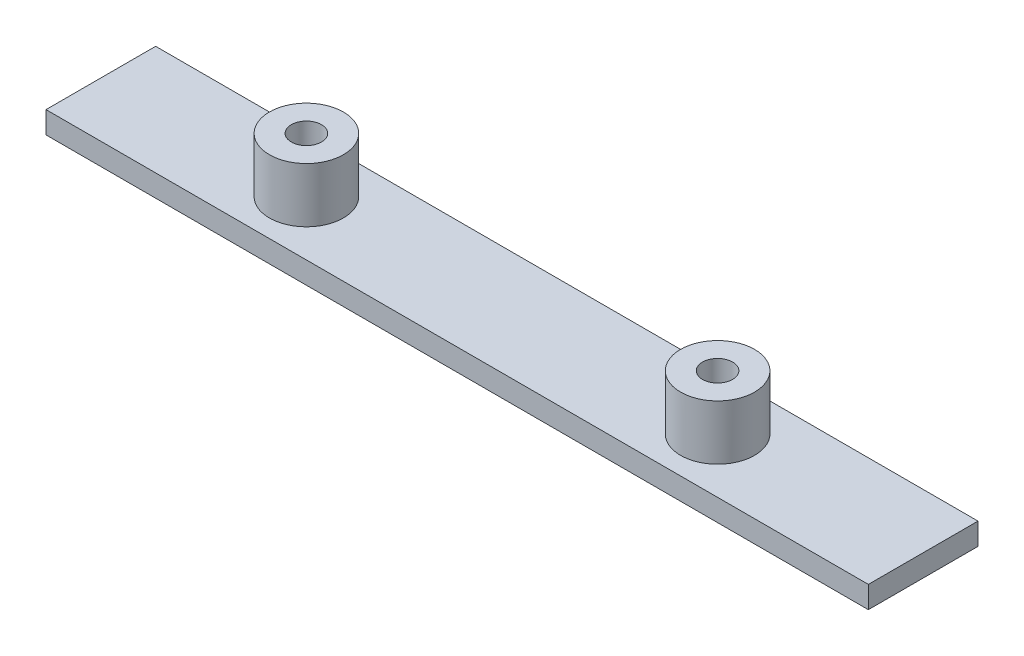
ISO-10303-21;
HEADER;
FILE_DESCRIPTION(('STEP AP214'),'2;1');
FILE_NAME('part.step','',(''),(''),'','','');
FILE_SCHEMA(('AUTOMOTIVE_DESIGN { 1 0 10303 214 1 1 1 1 }'));
ENDSEC;
DATA;
#1=APPLICATION_CONTEXT('core data for automotive mechanical design processes');
#2=APPLICATION_PROTOCOL_DEFINITION('international standard','automotive_design',2000,#1);
#3=PRODUCT_CONTEXT('',#1,'mechanical');
#4=PRODUCT('Part','Part','',(#3));
#5=PRODUCT_RELATED_PRODUCT_CATEGORY('part','',(#4));
#6=PRODUCT_DEFINITION_FORMATION('','',#4);
#7=PRODUCT_DEFINITION_CONTEXT('part definition',#1,'design');
#8=PRODUCT_DEFINITION('design','',#6,#7);
#9=PRODUCT_DEFINITION_SHAPE('','',#8);
#10=(LENGTH_UNIT() NAMED_UNIT(*) SI_UNIT(.MILLI.,.METRE.));
#11=(NAMED_UNIT(*) PLANE_ANGLE_UNIT() SI_UNIT($,.RADIAN.));
#12=(NAMED_UNIT(*) SI_UNIT($,.STERADIAN.) SOLID_ANGLE_UNIT());
#13=UNCERTAINTY_MEASURE_WITH_UNIT(LENGTH_MEASURE(1.E-05),#10,'distance_accuracy_value','');
#14=(GEOMETRIC_REPRESENTATION_CONTEXT(3) GLOBAL_UNCERTAINTY_ASSIGNED_CONTEXT((#13)) GLOBAL_UNIT_ASSIGNED_CONTEXT((#10,
#11,#12)) REPRESENTATION_CONTEXT('',''));
#15=CARTESIAN_POINT('',(0.,0.,0.));
#16=DIRECTION('',(0.,0.,1.));
#17=DIRECTION('',(1.,0.,0.));
#18=AXIS2_PLACEMENT_3D('',#15,#16,#17);
#19=CARTESIAN_POINT('',(37.5,2.,85.0266619276108));
#20=DIRECTION('',(0.,-1.,0.));
#21=DIRECTION('',(0.,0.,-1.));
#22=AXIS2_PLACEMENT_3D('',#19,#20,#21);
#23=PLANE('',#22);
#24=DIRECTION('',(-1.,0.,0.));
#25=VECTOR('',#24,1.);
#26=CARTESIAN_POINT('',(37.5,2.,9.99999999999999));
#27=LINE('',#26,#25);
#28=CARTESIAN_POINT('',(37.5,2.,9.99999999999999));
#29=VERTEX_POINT('',#28);
#30=CARTESIAN_POINT('',(-37.5,2.,9.99999999999999));
#31=VERTEX_POINT('',#30);
#32=EDGE_CURVE('E77',#29,#31,#27,.T.);
#33=ORIENTED_EDGE('',*,*,#32,.F.);
#34=DIRECTION('',(0.,0.,-1.));
#35=VECTOR('',#34,1.);
#36=CARTESIAN_POINT('',(37.5,2.,85.0266619276108));
#37=LINE('',#36,#35);
#38=CARTESIAN_POINT('',(37.5,2.,0.));
#39=VERTEX_POINT('',#38);
#40=EDGE_CURVE('E71',#29,#39,#37,.T.);
#41=ORIENTED_EDGE('',*,*,#40,.T.);
#42=DIRECTION('',(-1.,0.,0.));
#43=VECTOR('',#42,1.);
#44=CARTESIAN_POINT('',(37.5,2.,0.));
#45=LINE('',#44,#43);
#46=CARTESIAN_POINT('',(-37.5,2.,0.));
#47=VERTEX_POINT('',#46);
#48=EDGE_CURVE('E96',#39,#47,#45,.T.);
#49=ORIENTED_EDGE('',*,*,#48,.T.);
#50=DIRECTION('',(0.,0.,-1.));
#51=VECTOR('',#50,1.);
#52=CARTESIAN_POINT('',(-37.5,2.,85.0266619276108));
#53=LINE('',#52,#51);
#54=EDGE_CURVE('E108',#31,#47,#53,.T.);
#55=ORIENTED_EDGE('',*,*,#54,.F.);
#56=EDGE_LOOP('',(#33,#41,#49,#55));
#57=FACE_BOUND('',#56,.T.);
#58=CARTESIAN_POINT('',(18.75,2.,5.));
#59=DIRECTION('',(0.,-1.,0.));
#60=DIRECTION('',(0.,0.,-1.));
#61=AXIS2_PLACEMENT_3D('',#58,#59,#60);
#62=CIRCLE('',#61,3.375);
#63=CARTESIAN_POINT('',(18.75,2.,1.625));
#64=VERTEX_POINT('',#63);
#65=EDGE_CURVE('E41',#64,#64,#62,.F.);
#66=ORIENTED_EDGE('',*,*,#65,.F.);
#67=EDGE_LOOP('',(#66));
#68=FACE_BOUND('',#67,.T.);
#69=CARTESIAN_POINT('',(-18.75,2.,5.));
#70=DIRECTION('',(0.,-1.,0.));
#71=DIRECTION('',(0.,0.,-1.));
#72=AXIS2_PLACEMENT_3D('',#69,#70,#71);
#73=CIRCLE('',#72,3.375);
#74=CARTESIAN_POINT('',(-18.75,2.,1.625));
#75=VERTEX_POINT('',#74);
#76=EDGE_CURVE('E11',#75,#75,#73,.F.);
#77=ORIENTED_EDGE('',*,*,#76,.F.);
#78=EDGE_LOOP('',(#77));
#79=FACE_BOUND('',#78,.T.);
#80=ADVANCED_FACE('F33',(#57,#68,#79),#23,.F.);
#81=CARTESIAN_POINT('',(37.5,2.,85.0266619276108));
#82=DIRECTION('',(-1.,0.,0.));
#83=DIRECTION('',(0.,0.,1.));
#84=AXIS2_PLACEMENT_3D('',#81,#82,#83);
#85=PLANE('',#84);
#86=DIRECTION('',(0.,1.,0.));
#87=VECTOR('',#86,1.);
#88=CARTESIAN_POINT('',(37.5,2.,9.99999999999999));
#89=LINE('',#88,#87);
#90=CARTESIAN_POINT('',(37.5,0.,9.99999999999999));
#91=VERTEX_POINT('',#90);
#92=EDGE_CURVE('E84',#91,#29,#89,.T.);
#93=ORIENTED_EDGE('',*,*,#92,.F.);
#94=DIRECTION('',(0.,0.,-1.));
#95=VECTOR('',#94,1.);
#96=CARTESIAN_POINT('',(37.5,0.,85.0266619276108));
#97=LINE('',#96,#95);
#98=CARTESIAN_POINT('',(37.5,0.,0.));
#99=VERTEX_POINT('',#98);
#100=EDGE_CURVE('E48',#91,#99,#97,.T.);
#101=ORIENTED_EDGE('',*,*,#100,.T.);
#102=DIRECTION('',(0.,1.,0.));
#103=VECTOR('',#102,1.);
#104=CARTESIAN_POINT('',(37.5,2.,0.));
#105=LINE('',#104,#103);
#106=EDGE_CURVE('E82',#99,#39,#105,.T.);
#107=ORIENTED_EDGE('',*,*,#106,.T.);
#108=ORIENTED_EDGE('',*,*,#40,.F.);
#109=EDGE_LOOP('',(#93,#101,#107,#108));
#110=FACE_BOUND('',#109,.T.);
#111=ADVANCED_FACE('F80',(#110),#85,.F.);
#112=CARTESIAN_POINT('',(-37.5,2.,85.0266619276108));
#113=DIRECTION('',(1.,0.,0.));
#114=DIRECTION('',(0.,0.,-1.));
#115=AXIS2_PLACEMENT_3D('',#112,#113,#114);
#116=PLANE('',#115);
#117=DIRECTION('',(0.,-1.,0.));
#118=VECTOR('',#117,1.);
#119=CARTESIAN_POINT('',(-37.5,2.,9.99999999999999));
#120=LINE('',#119,#118);
#121=CARTESIAN_POINT('',(-37.5,0.,9.99999999999999));
#122=VERTEX_POINT('',#121);
#123=EDGE_CURVE('E102',#31,#122,#120,.T.);
#124=ORIENTED_EDGE('',*,*,#123,.F.);
#125=ORIENTED_EDGE('',*,*,#54,.T.);
#126=DIRECTION('',(0.,-1.,0.));
#127=VECTOR('',#126,1.);
#128=CARTESIAN_POINT('',(-37.5,2.,0.));
#129=LINE('',#128,#127);
#130=CARTESIAN_POINT('',(-37.5,0.,0.));
#131=VERTEX_POINT('',#130);
#132=EDGE_CURVE('E110',#47,#131,#129,.T.);
#133=ORIENTED_EDGE('',*,*,#132,.T.);
#134=DIRECTION('',(0.,0.,-1.));
#135=VECTOR('',#134,1.);
#136=CARTESIAN_POINT('',(-37.5,0.,85.0266619276108));
#137=LINE('',#136,#135);
#138=EDGE_CURVE('E54',#122,#131,#137,.T.);
#139=ORIENTED_EDGE('',*,*,#138,.F.);
#140=EDGE_LOOP('',(#124,#125,#133,#139));
#141=FACE_BOUND('',#140,.T.);
#142=ADVANCED_FACE('F152',(#141),#116,.F.);
#143=CARTESIAN_POINT('',(-37.5,0.,85.0266619276108));
#144=DIRECTION('',(0.,1.,0.));
#145=DIRECTION('',(0.,0.,1.));
#146=AXIS2_PLACEMENT_3D('',#143,#144,#145);
#147=PLANE('',#146);
#148=CARTESIAN_POINT('',(-18.75,0.,5.));
#149=DIRECTION('',(0.,1.,0.));
#150=DIRECTION('',(0.,0.,1.));
#151=AXIS2_PLACEMENT_3D('',#148,#149,#150);
#152=CIRCLE('',#151,1.375);
#153=CARTESIAN_POINT('',(-18.75,0.,6.375));
#154=VERTEX_POINT('',#153);
#155=EDGE_CURVE('E250',#154,#154,#152,.T.);
#156=ORIENTED_EDGE('',*,*,#155,.T.);
#157=EDGE_LOOP('',(#156));
#158=FACE_BOUND('',#157,.T.);
#159=CARTESIAN_POINT('',(18.75,0.,5.));
#160=DIRECTION('',(0.,1.,0.));
#161=DIRECTION('',(0.,0.,1.));
#162=AXIS2_PLACEMENT_3D('',#159,#160,#161);
#163=CIRCLE('',#162,1.375);
#164=CARTESIAN_POINT('',(18.75,0.,6.375));
#165=VERTEX_POINT('',#164);
#166=EDGE_CURVE('E247',#165,#165,#163,.T.);
#167=ORIENTED_EDGE('',*,*,#166,.T.);
#168=EDGE_LOOP('',(#167));
#169=FACE_BOUND('',#168,.T.);
#170=DIRECTION('',(1.,0.,0.));
#171=VECTOR('',#170,1.);
#172=CARTESIAN_POINT('',(-37.5,0.,9.99999999999999));
#173=LINE('',#172,#171);
#174=EDGE_CURVE('E93',#122,#91,#173,.T.);
#175=ORIENTED_EDGE('',*,*,#174,.F.);
#176=ORIENTED_EDGE('',*,*,#138,.T.);
#177=DIRECTION('',(1.,0.,0.));
#178=VECTOR('',#177,1.);
#179=CARTESIAN_POINT('',(-37.5,0.,0.));
#180=LINE('',#179,#178);
#181=EDGE_CURVE('E89',#131,#99,#180,.T.);
#182=ORIENTED_EDGE('',*,*,#181,.T.);
#183=ORIENTED_EDGE('',*,*,#100,.F.);
#184=EDGE_LOOP('',(#175,#176,#182,#183));
#185=FACE_BOUND('',#184,.T.);
#186=ADVANCED_FACE('F90',(#158,#169,#185),#147,.F.);
#187=CARTESIAN_POINT('',(37.5,0.,0.));
#188=DIRECTION('',(0.,0.,1.));
#189=DIRECTION('',(1.,0.,0.));
#190=AXIS2_PLACEMENT_3D('',#187,#188,#189);
#191=PLANE('',#190);
#192=ORIENTED_EDGE('',*,*,#106,.F.);
#193=ORIENTED_EDGE('',*,*,#181,.F.);
#194=ORIENTED_EDGE('',*,*,#132,.F.);
#195=ORIENTED_EDGE('',*,*,#48,.F.);
#196=EDGE_LOOP('',(#192,#193,#194,#195));
#197=FACE_BOUND('',#196,.T.);
#198=ADVANCED_FACE('F95',(#197),#191,.F.);
#199=CARTESIAN_POINT('',(37.5,-28.,10.));
#200=DIRECTION('',(0.,0.,1.));
#201=DIRECTION('',(0.,1.,0.));
#202=AXIS2_PLACEMENT_3D('',#199,#200,#201);
#203=PLANE('',#202);
#204=ORIENTED_EDGE('',*,*,#174,.T.);
#205=ORIENTED_EDGE('',*,*,#92,.T.);
#206=ORIENTED_EDGE('',*,*,#32,.T.);
#207=ORIENTED_EDGE('',*,*,#123,.T.);
#208=EDGE_LOOP('',(#204,#205,#206,#207));
#209=FACE_BOUND('',#208,.T.);
#210=ADVANCED_FACE('F35',(#209),#203,.T.);
#211=CARTESIAN_POINT('',(18.75,7.,5.));
#212=DIRECTION('',(0.,1.,0.));
#213=DIRECTION('',(0.,0.,1.));
#214=AXIS2_PLACEMENT_3D('',#211,#212,#213);
#215=PLANE('',#214);
#216=CARTESIAN_POINT('',(18.75,7.,5.));
#217=DIRECTION('',(0.,1.,0.));
#218=DIRECTION('',(0.,0.,1.));
#219=AXIS2_PLACEMENT_3D('',#216,#217,#218);
#220=CIRCLE('',#219,3.375);
#221=CARTESIAN_POINT('',(18.75,7.,8.375));
#222=VERTEX_POINT('',#221);
#223=EDGE_CURVE('E86',#222,#222,#220,.T.);
#224=ORIENTED_EDGE('',*,*,#223,.T.);
#225=EDGE_LOOP('',(#224));
#226=FACE_BOUND('',#225,.T.);
#227=CARTESIAN_POINT('',(18.75,7.,5.));
#228=DIRECTION('',(0.,1.,0.));
#229=DIRECTION('',(0.,0.,1.));
#230=AXIS2_PLACEMENT_3D('',#227,#228,#229);
#231=CIRCLE('',#230,1.375);
#232=CARTESIAN_POINT('',(18.75,7.,6.375));
#233=VERTEX_POINT('',#232);
#234=EDGE_CURVE('E238',#233,#233,#231,.T.);
#235=ORIENTED_EDGE('',*,*,#234,.F.);
#236=EDGE_LOOP('',(#235));
#237=FACE_BOUND('',#236,.T.);
#238=ADVANCED_FACE('F141',(#226,#237),#215,.T.);
#239=CARTESIAN_POINT('',(18.75,7.,5.));
#240=DIRECTION('',(0.,-1.,0.));
#241=DIRECTION('',(0.,0.,-1.));
#242=AXIS2_PLACEMENT_3D('',#239,#240,#241);
#243=CYLINDRICAL_SURFACE('',#242,3.375);
#244=ORIENTED_EDGE('',*,*,#223,.F.);
#245=EDGE_LOOP('',(#244));
#246=FACE_BOUND('',#245,.T.);
#247=ORIENTED_EDGE('',*,*,#65,.T.);
#248=EDGE_LOOP('',(#247));
#249=FACE_BOUND('',#248,.T.);
#250=ADVANCED_FACE('F114',(#246,#249),#243,.T.);
#251=CARTESIAN_POINT('',(18.75,7.,5.));
#252=DIRECTION('',(0.,-1.,0.));
#253=DIRECTION('',(0.,0.,-1.));
#254=AXIS2_PLACEMENT_3D('',#251,#252,#253);
#255=CYLINDRICAL_SURFACE('',#254,1.375);
#256=ORIENTED_EDGE('',*,*,#234,.T.);
#257=EDGE_LOOP('',(#256));
#258=FACE_BOUND('',#257,.T.);
#259=ORIENTED_EDGE('',*,*,#166,.F.);
#260=EDGE_LOOP('',(#259));
#261=FACE_BOUND('',#260,.T.);
#262=ADVANCED_FACE('F133',(#258,#261),#255,.F.);
#263=CARTESIAN_POINT('',(-18.75,7.,5.));
#264=DIRECTION('',(0.,-1.,0.));
#265=DIRECTION('',(0.,0.,-1.));
#266=AXIS2_PLACEMENT_3D('',#263,#264,#265);
#267=PLANE('',#266);
#268=CARTESIAN_POINT('',(-18.75,7.,5.));
#269=DIRECTION('',(0.,1.,0.));
#270=DIRECTION('',(0.,0.,-1.));
#271=AXIS2_PLACEMENT_3D('',#268,#269,#270);
#272=CIRCLE('',#271,3.375);
#273=CARTESIAN_POINT('',(-18.75,7.,1.625));
#274=VERTEX_POINT('',#273);
#275=EDGE_CURVE('E241',#274,#274,#272,.T.);
#276=ORIENTED_EDGE('',*,*,#275,.T.);
#277=EDGE_LOOP('',(#276));
#278=FACE_BOUND('',#277,.T.);
#279=CARTESIAN_POINT('',(-18.75,7.,5.));
#280=DIRECTION('',(0.,1.,0.));
#281=DIRECTION('',(0.,0.,-1.));
#282=AXIS2_PLACEMENT_3D('',#279,#280,#281);
#283=CIRCLE('',#282,1.375);
#284=CARTESIAN_POINT('',(-18.75,7.,3.625));
#285=VERTEX_POINT('',#284);
#286=EDGE_CURVE('E244',#285,#285,#283,.T.);
#287=ORIENTED_EDGE('',*,*,#286,.F.);
#288=EDGE_LOOP('',(#287));
#289=FACE_BOUND('',#288,.T.);
#290=ADVANCED_FACE('F124',(#278,#289),#267,.F.);
#291=CARTESIAN_POINT('',(-18.75,7.,5.));
#292=DIRECTION('',(0.,-1.,0.));
#293=DIRECTION('',(0.,0.,-1.));
#294=AXIS2_PLACEMENT_3D('',#291,#292,#293);
#295=CYLINDRICAL_SURFACE('',#294,3.375);
#296=ORIENTED_EDGE('',*,*,#275,.F.);
#297=EDGE_LOOP('',(#296));
#298=FACE_BOUND('',#297,.T.);
#299=ORIENTED_EDGE('',*,*,#76,.T.);
#300=EDGE_LOOP('',(#299));
#301=FACE_BOUND('',#300,.T.);
#302=ADVANCED_FACE('F121',(#298,#301),#295,.T.);
#303=CARTESIAN_POINT('',(-18.75,7.,5.));
#304=DIRECTION('',(0.,-1.,0.));
#305=DIRECTION('',(0.,0.,-1.));
#306=AXIS2_PLACEMENT_3D('',#303,#304,#305);
#307=CYLINDRICAL_SURFACE('',#306,1.375);
#308=ORIENTED_EDGE('',*,*,#286,.T.);
#309=EDGE_LOOP('',(#308));
#310=FACE_BOUND('',#309,.T.);
#311=ORIENTED_EDGE('',*,*,#155,.F.);
#312=EDGE_LOOP('',(#311));
#313=FACE_BOUND('',#312,.T.);
#314=ADVANCED_FACE('F123',(#310,#313),#307,.F.);
#315=CLOSED_SHELL('',(#80,#111,#142,#186,#198,#210,#238,#250,#262,#290,#302,#314));
#316=MANIFOLD_SOLID_BREP('B2',#315);
#317=ADVANCED_BREP_SHAPE_REPRESENTATION('',(#18,#316),#14);
#318=SHAPE_DEFINITION_REPRESENTATION(#9,#317);
ENDSEC;
END-ISO-10303-21;
